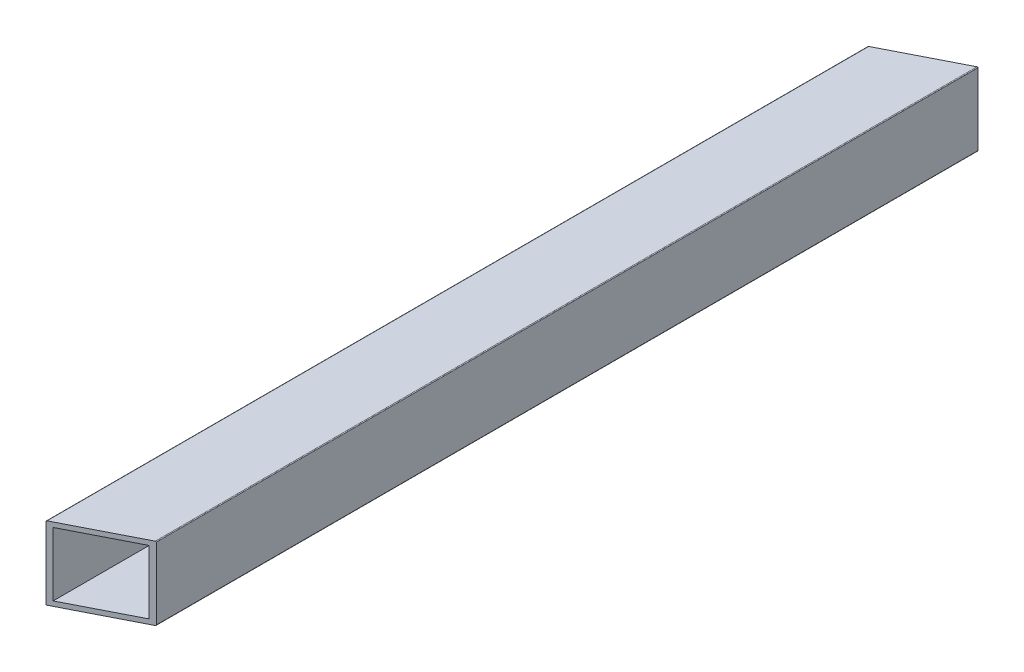
ISO-10303-21;
HEADER;
FILE_DESCRIPTION(('STEP AP214'),'2;1');
FILE_NAME('part.step','',(''),(''),'','','');
FILE_SCHEMA(('AUTOMOTIVE_DESIGN { 1 0 10303 214 1 1 1 1 }'));
ENDSEC;
DATA;
#1=APPLICATION_CONTEXT('core data for automotive mechanical design processes');
#2=APPLICATION_PROTOCOL_DEFINITION('international standard','automotive_design',2000,#1);
#3=PRODUCT_CONTEXT('',#1,'mechanical');
#4=PRODUCT('Part','Part','',(#3));
#5=PRODUCT_RELATED_PRODUCT_CATEGORY('part','',(#4));
#6=PRODUCT_DEFINITION_FORMATION('','',#4);
#7=PRODUCT_DEFINITION_CONTEXT('part definition',#1,'design');
#8=PRODUCT_DEFINITION('design','',#6,#7);
#9=PRODUCT_DEFINITION_SHAPE('','',#8);
#10=(LENGTH_UNIT() NAMED_UNIT(*) SI_UNIT(.MILLI.,.METRE.));
#11=(NAMED_UNIT(*) PLANE_ANGLE_UNIT() SI_UNIT($,.RADIAN.));
#12=(NAMED_UNIT(*) SI_UNIT($,.STERADIAN.) SOLID_ANGLE_UNIT());
#13=UNCERTAINTY_MEASURE_WITH_UNIT(LENGTH_MEASURE(1.E-05),#10,'distance_accuracy_value','');
#14=(GEOMETRIC_REPRESENTATION_CONTEXT(3) GLOBAL_UNCERTAINTY_ASSIGNED_CONTEXT((#13)) GLOBAL_UNIT_ASSIGNED_CONTEXT((#10,
#11,#12)) REPRESENTATION_CONTEXT('',''));
#15=CARTESIAN_POINT('',(0.,0.,0.));
#16=DIRECTION('',(0.,0.,1.));
#17=DIRECTION('',(1.,0.,0.));
#18=AXIS2_PLACEMENT_3D('',#15,#16,#17);
#19=CARTESIAN_POINT('',(-12.7,25.4,149.225));
#20=DIRECTION('',(-0.453990499739547,0.,-0.891006524188368));
#21=DIRECTION('',(-0.891006524188368,0.,0.453990499739547));
#22=AXIS2_PLACEMENT_3D('',#19,#20,#21);
#23=PLANE('',#22);
#24=CARTESIAN_POINT('',(-12.446,-12.446,149.095580535828));
#25=DIRECTION('',(-0.453990499739547,0.,-0.891006524188368));
#26=DIRECTION('',(-0.891006524188368,0.,0.453990499739547));
#27=AXIS2_PLACEMENT_3D('',#24,#25,#26);
#28=ELLIPSE('',#27,0.285070864359128,0.254);
#29=CARTESIAN_POINT('',(-12.7,-12.446,149.225));
#30=VERTEX_POINT('',#29);
#31=CARTESIAN_POINT('',(-12.446,-12.7,149.095580535828));
#32=VERTEX_POINT('',#31);
#33=EDGE_CURVE('E137',#30,#32,#28,.F.);
#34=ORIENTED_EDGE('',*,*,#33,.T.);
#35=DIRECTION('',(0.891006524188367,0.,-0.453990499739547));
#36=VECTOR('',#35,1.);
#37=CARTESIAN_POINT('',(-12.7,-12.7,149.225));
#38=LINE('',#37,#36);
#39=CARTESIAN_POINT('',(12.446,-12.7,136.412473047013));
#40=VERTEX_POINT('',#39);
#41=EDGE_CURVE('E178',#32,#40,#38,.T.);
#42=ORIENTED_EDGE('',*,*,#41,.T.);
#43=CARTESIAN_POINT('',(12.446,-12.446,136.412473047013));
#44=DIRECTION('',(-0.453990499739547,0.,-0.891006524188368));
#45=DIRECTION('',(0.891006524188368,0.,-0.453990499739547));
#46=AXIS2_PLACEMENT_3D('',#43,#44,#45);
#47=ELLIPSE('',#46,0.285070864359128,0.254);
#48=CARTESIAN_POINT('',(12.7,-12.446,136.283053582841));
#49=VERTEX_POINT('',#48);
#50=EDGE_CURVE('E199',#40,#49,#47,.F.);
#51=ORIENTED_EDGE('',*,*,#50,.T.);
#52=DIRECTION('',(0.,-1.,0.));
#53=VECTOR('',#52,1.);
#54=CARTESIAN_POINT('',(12.7,25.4,136.283053582841));
#55=LINE('',#54,#53);
#56=CARTESIAN_POINT('',(12.7,12.446,136.283053582841));
#57=VERTEX_POINT('',#56);
#58=EDGE_CURVE('E192',#57,#49,#55,.T.);
#59=ORIENTED_EDGE('',*,*,#58,.F.);
#60=CARTESIAN_POINT('',(12.446,12.446,136.412473047013));
#61=DIRECTION('',(-0.453990499739547,0.,-0.891006524188368));
#62=DIRECTION('',(-0.891006524188368,0.,0.453990499739547));
#63=AXIS2_PLACEMENT_3D('',#60,#61,#62);
#64=ELLIPSE('',#63,0.285070864359128,0.254);
#65=CARTESIAN_POINT('',(12.446,12.7,136.412473047013));
#66=VERTEX_POINT('',#65);
#67=EDGE_CURVE('E140',#57,#66,#64,.F.);
#68=ORIENTED_EDGE('',*,*,#67,.T.);
#69=DIRECTION('',(-0.891006524188368,0.,0.453990499739547));
#70=VECTOR('',#69,1.);
#71=CARTESIAN_POINT('',(-12.7,12.7,149.225));
#72=LINE('',#71,#70);
#73=CARTESIAN_POINT('',(-12.446,12.7,149.095580535828));
#74=VERTEX_POINT('',#73);
#75=EDGE_CURVE('E194',#66,#74,#72,.T.);
#76=ORIENTED_EDGE('',*,*,#75,.T.);
#77=CARTESIAN_POINT('',(-12.446,12.446,149.095580535828));
#78=DIRECTION('',(-0.453990499739547,0.,-0.891006524188368));
#79=DIRECTION('',(0.891006524188368,0.,-0.453990499739547));
#80=AXIS2_PLACEMENT_3D('',#77,#78,#79);
#81=ELLIPSE('',#80,0.285070864359128,0.254);
#82=CARTESIAN_POINT('',(-12.7,12.446,149.225));
#83=VERTEX_POINT('',#82);
#84=EDGE_CURVE('E197',#74,#83,#81,.F.);
#85=ORIENTED_EDGE('',*,*,#84,.T.);
#86=DIRECTION('',(0.,1.,0.));
#87=VECTOR('',#86,1.);
#88=CARTESIAN_POINT('',(-12.7,-12.7,149.225));
#89=LINE('',#88,#87);
#90=EDGE_CURVE('E136',#30,#83,#89,.T.);
#91=ORIENTED_EDGE('',*,*,#90,.F.);
#92=EDGE_LOOP('',(#34,#42,#51,#59,#68,#76,#85,#91));
#93=FACE_BOUND('',#92,.T.);
#94=DIRECTION('',(-0.891006524188368,0.,0.453990499739547));
#95=VECTOR('',#94,1.);
#96=CARTESIAN_POINT('',(-12.7,11.049,149.225));
#97=LINE('',#96,#95);
#98=CARTESIAN_POINT('',(11.049,11.049,137.124280099957));
#99=VERTEX_POINT('',#98);
#100=CARTESIAN_POINT('',(-11.049,11.049,148.383773482885));
#101=VERTEX_POINT('',#100);
#102=EDGE_CURVE('E40',#99,#101,#97,.T.);
#103=ORIENTED_EDGE('',*,*,#102,.F.);
#104=DIRECTION('',(0.,1.,0.));
#105=VECTOR('',#104,1.);
#106=CARTESIAN_POINT('',(11.049,25.4,137.124280099957));
#107=LINE('',#106,#105);
#108=CARTESIAN_POINT('',(11.049,-11.049,137.124280099957));
#109=VERTEX_POINT('',#108);
#110=EDGE_CURVE('E153',#109,#99,#107,.T.);
#111=ORIENTED_EDGE('',*,*,#110,.F.);
#112=DIRECTION('',(-0.891006524188368,0.,0.453990499739547));
#113=VECTOR('',#112,1.);
#114=CARTESIAN_POINT('',(-12.7,-11.049,149.225));
#115=LINE('',#114,#113);
#116=CARTESIAN_POINT('',(-11.049,-11.049,148.383773482885));
#117=VERTEX_POINT('',#116);
#118=EDGE_CURVE('E155',#109,#117,#115,.T.);
#119=ORIENTED_EDGE('',*,*,#118,.T.);
#120=DIRECTION('',(0.,1.,0.));
#121=VECTOR('',#120,1.);
#122=CARTESIAN_POINT('',(-11.049,25.4,148.383773482885));
#123=LINE('',#122,#121);
#124=EDGE_CURVE('E158',#117,#101,#123,.T.);
#125=ORIENTED_EDGE('',*,*,#124,.T.);
#126=EDGE_LOOP('',(#103,#111,#119,#125));
#127=FACE_BOUND('',#126,.T.);
#128=ADVANCED_FACE('F32',(#93,#127),#23,.F.);
#129=CARTESIAN_POINT('',(-12.7,12.7,149.225));
#130=DIRECTION('',(0.,1.,0.));
#131=DIRECTION('',(0.,0.,1.));
#132=AXIS2_PLACEMENT_3D('',#129,#130,#131);
#133=PLANE('',#132);
#134=DIRECTION('',(0.891006524188371,0.,-0.453990499739541));
#135=VECTOR('',#134,1.);
#136=CARTESIAN_POINT('',(-128.190433689715,12.7,-77.4377384447841));
#137=LINE('',#136,#135);
#138=CARTESIAN_POINT('',(-12.446,12.7,-136.412473047013));
#139=VERTEX_POINT('',#138);
#140=CARTESIAN_POINT('',(12.446,12.7,-149.095580535828));
#141=VERTEX_POINT('',#140);
#142=EDGE_CURVE('E47',#139,#141,#137,.T.);
#143=ORIENTED_EDGE('',*,*,#142,.F.);
#144=DIRECTION('',(0.,0.,-1.));
#145=VECTOR('',#144,1.);
#146=CARTESIAN_POINT('',(-12.446,12.7,149.225));
#147=LINE('',#146,#145);
#148=EDGE_CURVE('E150',#139,#74,#147,.F.);
#149=ORIENTED_EDGE('',*,*,#148,.T.);
#150=ORIENTED_EDGE('',*,*,#75,.F.);
#151=DIRECTION('',(0.,0.,-1.));
#152=VECTOR('',#151,1.);
#153=CARTESIAN_POINT('',(12.446,12.7,-149.225));
#154=LINE('',#153,#152);
#155=EDGE_CURVE('E143',#66,#141,#154,.T.);
#156=ORIENTED_EDGE('',*,*,#155,.T.);
#157=EDGE_LOOP('',(#143,#149,#150,#156));
#158=FACE_BOUND('',#157,.T.);
#159=ADVANCED_FACE('F258',(#158),#133,.T.);
#160=CARTESIAN_POINT('',(-12.7,-12.7,149.225));
#161=DIRECTION('',(-1.,0.,0.));
#162=DIRECTION('',(0.,0.,1.));
#163=AXIS2_PLACEMENT_3D('',#160,#161,#162);
#164=PLANE('',#163);
#165=DIRECTION('',(0.,-1.,0.));
#166=VECTOR('',#165,1.);
#167=CARTESIAN_POINT('',(-12.7,673.1,-136.283053582842));
#168=LINE('',#167,#166);
#169=CARTESIAN_POINT('',(-12.7,12.446,-136.283053582842));
#170=VERTEX_POINT('',#169);
#171=CARTESIAN_POINT('',(-12.7,-12.446,-136.283053582842));
#172=VERTEX_POINT('',#171);
#173=EDGE_CURVE('E213',#170,#172,#168,.T.);
#174=ORIENTED_EDGE('',*,*,#173,.T.);
#175=DIRECTION('',(0.,0.,-1.));
#176=VECTOR('',#175,1.);
#177=CARTESIAN_POINT('',(-12.7,-12.446,149.225));
#178=LINE('',#177,#176);
#179=EDGE_CURVE('E141',#172,#30,#178,.F.);
#180=ORIENTED_EDGE('',*,*,#179,.T.);
#181=ORIENTED_EDGE('',*,*,#90,.T.);
#182=DIRECTION('',(0.,0.,-1.));
#183=VECTOR('',#182,1.);
#184=CARTESIAN_POINT('',(-12.7,12.446,149.225));
#185=LINE('',#184,#183);
#186=EDGE_CURVE('E145',#83,#170,#185,.T.);
#187=ORIENTED_EDGE('',*,*,#186,.T.);
#188=EDGE_LOOP('',(#174,#180,#181,#187));
#189=FACE_BOUND('',#188,.T.);
#190=ADVANCED_FACE('F212',(#189),#164,.T.);
#191=CARTESIAN_POINT('',(-12.7,-12.7,149.225));
#192=DIRECTION('',(0.,1.,0.));
#193=DIRECTION('',(0.,0.,1.));
#194=AXIS2_PLACEMENT_3D('',#191,#192,#193);
#195=PLANE('',#194);
#196=DIRECTION('',(0.,0.,-1.));
#197=VECTOR('',#196,1.);
#198=CARTESIAN_POINT('',(-12.446,-12.7,-149.225));
#199=LINE('',#198,#197);
#200=CARTESIAN_POINT('',(-12.446,-12.7,-136.412473047013));
#201=VERTEX_POINT('',#200);
#202=EDGE_CURVE('E206',#32,#201,#199,.T.);
#203=ORIENTED_EDGE('',*,*,#202,.T.);
#204=DIRECTION('',(-0.891006524188371,0.,0.453990499739541));
#205=VECTOR('',#204,1.);
#206=CARTESIAN_POINT('',(12.7,-12.7,-149.225));
#207=LINE('',#206,#205);
#208=CARTESIAN_POINT('',(12.446,-12.7,-149.095580535828));
#209=VERTEX_POINT('',#208);
#210=EDGE_CURVE('E235',#209,#201,#207,.T.);
#211=ORIENTED_EDGE('',*,*,#210,.F.);
#212=DIRECTION('',(0.,0.,-1.));
#213=VECTOR('',#212,1.);
#214=CARTESIAN_POINT('',(12.446,-12.7,149.225));
#215=LINE('',#214,#213);
#216=EDGE_CURVE('E203',#209,#40,#215,.F.);
#217=ORIENTED_EDGE('',*,*,#216,.T.);
#218=ORIENTED_EDGE('',*,*,#41,.F.);
#219=EDGE_LOOP('',(#203,#211,#217,#218));
#220=FACE_BOUND('',#219,.T.);
#221=ADVANCED_FACE('F245',(#220),#195,.F.);
#222=CARTESIAN_POINT('',(12.7,-12.7,149.225));
#223=DIRECTION('',(-1.,0.,0.));
#224=DIRECTION('',(0.,0.,1.));
#225=AXIS2_PLACEMENT_3D('',#222,#223,#224);
#226=PLANE('',#225);
#227=DIRECTION('',(0.,0.,-1.));
#228=VECTOR('',#227,1.);
#229=CARTESIAN_POINT('',(12.7,12.446,149.225));
#230=LINE('',#229,#228);
#231=CARTESIAN_POINT('',(12.7,12.446,-149.225));
#232=VERTEX_POINT('',#231);
#233=EDGE_CURVE('E133',#232,#57,#230,.F.);
#234=ORIENTED_EDGE('',*,*,#233,.T.);
#235=ORIENTED_EDGE('',*,*,#58,.T.);
#236=DIRECTION('',(0.,0.,-1.));
#237=VECTOR('',#236,1.);
#238=CARTESIAN_POINT('',(12.7,-12.446,149.225));
#239=LINE('',#238,#237);
#240=CARTESIAN_POINT('',(12.7,-12.446,-149.225));
#241=VERTEX_POINT('',#240);
#242=EDGE_CURVE('E135',#49,#241,#239,.T.);
#243=ORIENTED_EDGE('',*,*,#242,.T.);
#244=DIRECTION('',(0.,1.,0.));
#245=VECTOR('',#244,1.);
#246=CARTESIAN_POINT('',(12.7,-12.7,-149.225));
#247=LINE('',#246,#245);
#248=EDGE_CURVE('E120',#241,#232,#247,.T.);
#249=ORIENTED_EDGE('',*,*,#248,.T.);
#250=EDGE_LOOP('',(#234,#235,#243,#249));
#251=FACE_BOUND('',#250,.T.);
#252=ADVANCED_FACE('F131',(#251),#226,.F.);
#253=CARTESIAN_POINT('',(-12.446,-12.446,149.225));
#254=DIRECTION('',(0.,0.,1.));
#255=DIRECTION('',(1.,0.,0.));
#256=AXIS2_PLACEMENT_3D('',#253,#254,#255);
#257=CYLINDRICAL_SURFACE('',#256,0.254);
#258=CARTESIAN_POINT('',(-12.446,-12.446,-136.412473047013));
#259=DIRECTION('',(0.453990499739541,0.,0.891006524188371));
#260=DIRECTION('',(-0.891006524188371,0.,0.453990499739541));
#261=AXIS2_PLACEMENT_3D('',#258,#259,#260);
#262=ELLIPSE('',#261,0.285070864359127,0.254);
#263=EDGE_CURVE('E224',#201,#172,#262,.F.);
#264=ORIENTED_EDGE('',*,*,#263,.F.);
#265=ORIENTED_EDGE('',*,*,#202,.F.);
#266=ORIENTED_EDGE('',*,*,#33,.F.);
#267=ORIENTED_EDGE('',*,*,#179,.F.);
#268=EDGE_LOOP('',(#264,#265,#266,#267));
#269=FACE_BOUND('',#268,.T.);
#270=ADVANCED_FACE('F242',(#269),#257,.T.);
#271=CARTESIAN_POINT('',(12.446,-12.446,149.225));
#272=DIRECTION('',(0.,0.,-1.));
#273=DIRECTION('',(-1.,0.,0.));
#274=AXIS2_PLACEMENT_3D('',#271,#272,#273);
#275=CYLINDRICAL_SURFACE('',#274,0.254);
#276=CARTESIAN_POINT('',(12.446,-12.446,-149.095580535828));
#277=DIRECTION('',(0.453990499739541,0.,0.891006524188371));
#278=DIRECTION('',(0.891006524188371,0.,-0.453990499739541));
#279=AXIS2_PLACEMENT_3D('',#276,#277,#278);
#280=ELLIPSE('',#279,0.285070864359127,0.254);
#281=EDGE_CURVE('E222',#241,#209,#280,.F.);
#282=ORIENTED_EDGE('',*,*,#281,.F.);
#283=ORIENTED_EDGE('',*,*,#242,.F.);
#284=ORIENTED_EDGE('',*,*,#50,.F.);
#285=ORIENTED_EDGE('',*,*,#216,.F.);
#286=EDGE_LOOP('',(#282,#283,#284,#285));
#287=FACE_BOUND('',#286,.T.);
#288=ADVANCED_FACE('F249',(#287),#275,.T.);
#289=CARTESIAN_POINT('',(-12.446,12.446,149.225));
#290=DIRECTION('',(0.,0.,-1.));
#291=DIRECTION('',(-1.,0.,0.));
#292=AXIS2_PLACEMENT_3D('',#289,#290,#291);
#293=CYLINDRICAL_SURFACE('',#292,0.254);
#294=CARTESIAN_POINT('',(-12.446,12.446,-136.412473047013));
#295=DIRECTION('',(0.453990499739541,0.,0.891006524188371));
#296=DIRECTION('',(0.891006524188371,0.,-0.453990499739541));
#297=AXIS2_PLACEMENT_3D('',#294,#295,#296);
#298=ELLIPSE('',#297,0.285070864359127,0.254);
#299=EDGE_CURVE('E221',#170,#139,#298,.F.);
#300=ORIENTED_EDGE('',*,*,#299,.F.);
#301=ORIENTED_EDGE('',*,*,#186,.F.);
#302=ORIENTED_EDGE('',*,*,#84,.F.);
#303=ORIENTED_EDGE('',*,*,#148,.F.);
#304=EDGE_LOOP('',(#300,#301,#302,#303));
#305=FACE_BOUND('',#304,.T.);
#306=ADVANCED_FACE('F219',(#305),#293,.T.);
#307=CARTESIAN_POINT('',(12.446,12.446,149.225));
#308=DIRECTION('',(0.,0.,1.));
#309=DIRECTION('',(1.,0.,0.));
#310=AXIS2_PLACEMENT_3D('',#307,#308,#309);
#311=CYLINDRICAL_SURFACE('',#310,0.254);
#312=CARTESIAN_POINT('',(12.446,12.446,-149.095580535828));
#313=DIRECTION('',(0.453990499739541,0.,0.891006524188371));
#314=DIRECTION('',(-0.891006524188371,0.,0.453990499739541));
#315=AXIS2_PLACEMENT_3D('',#312,#313,#314);
#316=ELLIPSE('',#315,0.285070864359127,0.254);
#317=EDGE_CURVE('E117',#141,#232,#316,.F.);
#318=ORIENTED_EDGE('',*,*,#317,.F.);
#319=ORIENTED_EDGE('',*,*,#155,.F.);
#320=ORIENTED_EDGE('',*,*,#67,.F.);
#321=ORIENTED_EDGE('',*,*,#233,.F.);
#322=EDGE_LOOP('',(#318,#319,#320,#321));
#323=FACE_BOUND('',#322,.T.);
#324=ADVANCED_FACE('F34',(#323),#311,.T.);
#325=CARTESIAN_POINT('',(11.049,11.049,536.575));
#326=DIRECTION('',(0.,-1.,0.));
#327=DIRECTION('',(0.,0.,-1.));
#328=AXIS2_PLACEMENT_3D('',#325,#326,#327);
#329=PLANE('',#328);
#330=DIRECTION('',(-0.891006524188371,0.,0.453990499739541));
#331=VECTOR('',#330,1.);
#332=CARTESIAN_POINT('',(-266.022644096934,11.049,-7.20871948223611));
#333=LINE('',#332,#331);
#334=CARTESIAN_POINT('',(11.049,11.049,-148.383773482885));
#335=VERTEX_POINT('',#334);
#336=CARTESIAN_POINT('',(-11.049,11.049,-137.124280099957));
#337=VERTEX_POINT('',#336);
#338=EDGE_CURVE('E126',#335,#337,#333,.T.);
#339=ORIENTED_EDGE('',*,*,#338,.F.);
#340=DIRECTION('',(0.,0.,-1.));
#341=VECTOR('',#340,1.);
#342=CARTESIAN_POINT('',(11.049,11.049,536.575));
#343=LINE('',#342,#341);
#344=EDGE_CURVE('E169',#99,#335,#343,.T.);
#345=ORIENTED_EDGE('',*,*,#344,.F.);
#346=ORIENTED_EDGE('',*,*,#102,.T.);
#347=DIRECTION('',(0.,0.,-1.));
#348=VECTOR('',#347,1.);
#349=CARTESIAN_POINT('',(-11.049,11.049,536.575));
#350=LINE('',#349,#348);
#351=EDGE_CURVE('E167',#101,#337,#350,.T.);
#352=ORIENTED_EDGE('',*,*,#351,.T.);
#353=EDGE_LOOP('',(#339,#345,#346,#352));
#354=FACE_BOUND('',#353,.T.);
#355=ADVANCED_FACE('F166',(#354),#329,.T.);
#356=CARTESIAN_POINT('',(-11.049,-11.049,536.575));
#357=DIRECTION('',(-1.,0.,0.));
#358=DIRECTION('',(0.,0.,1.));
#359=AXIS2_PLACEMENT_3D('',#356,#357,#358);
#360=PLANE('',#359);
#361=DIRECTION('',(0.,0.,-1.));
#362=VECTOR('',#361,1.);
#363=CARTESIAN_POINT('',(-11.049,-11.049,536.575));
#364=LINE('',#363,#362);
#365=CARTESIAN_POINT('',(-11.049,-11.049,-137.124280099957));
#366=VERTEX_POINT('',#365);
#367=EDGE_CURVE('E179',#117,#366,#364,.T.);
#368=ORIENTED_EDGE('',*,*,#367,.T.);
#369=DIRECTION('',(0.,1.,0.));
#370=VECTOR('',#369,1.);
#371=CARTESIAN_POINT('',(-11.049,-11.049,-137.124280099957));
#372=LINE('',#371,#370);
#373=EDGE_CURVE('E177',#366,#337,#372,.T.);
#374=ORIENTED_EDGE('',*,*,#373,.T.);
#375=ORIENTED_EDGE('',*,*,#351,.F.);
#376=ORIENTED_EDGE('',*,*,#124,.F.);
#377=EDGE_LOOP('',(#368,#374,#375,#376));
#378=FACE_BOUND('',#377,.T.);
#379=ADVANCED_FACE('F175',(#378),#360,.F.);
#380=CARTESIAN_POINT('',(11.049,-11.049,536.575));
#381=DIRECTION('',(0.,-1.,0.));
#382=DIRECTION('',(0.,0.,-1.));
#383=AXIS2_PLACEMENT_3D('',#380,#381,#382);
#384=PLANE('',#383);
#385=DIRECTION('',(0.,0.,-1.));
#386=VECTOR('',#385,1.);
#387=CARTESIAN_POINT('',(11.049,-11.049,536.575));
#388=LINE('',#387,#386);
#389=CARTESIAN_POINT('',(11.049,-11.049,-148.383773482885));
#390=VERTEX_POINT('',#389);
#391=EDGE_CURVE('E185',#109,#390,#388,.T.);
#392=ORIENTED_EDGE('',*,*,#391,.T.);
#393=DIRECTION('',(-0.891006524188371,0.,0.453990499739541));
#394=VECTOR('',#393,1.);
#395=CARTESIAN_POINT('',(-266.022644096934,-11.049,-7.20871948223611));
#396=LINE('',#395,#394);
#397=EDGE_CURVE('E54',#390,#366,#396,.T.);
#398=ORIENTED_EDGE('',*,*,#397,.T.);
#399=ORIENTED_EDGE('',*,*,#367,.F.);
#400=ORIENTED_EDGE('',*,*,#118,.F.);
#401=EDGE_LOOP('',(#392,#398,#399,#400));
#402=FACE_BOUND('',#401,.T.);
#403=ADVANCED_FACE('F184',(#402),#384,.F.);
#404=CARTESIAN_POINT('',(11.049,-11.049,536.575));
#405=DIRECTION('',(-1.,0.,0.));
#406=DIRECTION('',(0.,0.,1.));
#407=AXIS2_PLACEMENT_3D('',#404,#405,#406);
#408=PLANE('',#407);
#409=DIRECTION('',(0.,1.,0.));
#410=VECTOR('',#409,1.);
#411=CARTESIAN_POINT('',(11.049,-11.049,-148.383773482885));
#412=LINE('',#411,#410);
#413=EDGE_CURVE('E11',#390,#335,#412,.T.);
#414=ORIENTED_EDGE('',*,*,#413,.F.);
#415=ORIENTED_EDGE('',*,*,#391,.F.);
#416=ORIENTED_EDGE('',*,*,#110,.T.);
#417=ORIENTED_EDGE('',*,*,#344,.T.);
#418=EDGE_LOOP('',(#414,#415,#416,#417));
#419=FACE_BOUND('',#418,.T.);
#420=ADVANCED_FACE('F229',(#419),#408,.T.);
#421=CARTESIAN_POINT('',(12.7,673.1,-149.225));
#422=DIRECTION('',(0.453990499739541,0.,0.891006524188371));
#423=DIRECTION('',(0.891006524188371,0.,-0.453990499739541));
#424=AXIS2_PLACEMENT_3D('',#421,#422,#423);
#425=PLANE('',#424);
#426=ORIENTED_EDGE('',*,*,#263,.T.);
#427=ORIENTED_EDGE('',*,*,#173,.F.);
#428=ORIENTED_EDGE('',*,*,#299,.T.);
#429=ORIENTED_EDGE('',*,*,#142,.T.);
#430=ORIENTED_EDGE('',*,*,#317,.T.);
#431=ORIENTED_EDGE('',*,*,#248,.F.);
#432=ORIENTED_EDGE('',*,*,#281,.T.);
#433=ORIENTED_EDGE('',*,*,#210,.T.);
#434=EDGE_LOOP('',(#426,#427,#428,#429,#430,#431,#432,#433));
#435=FACE_BOUND('',#434,.T.);
#436=ORIENTED_EDGE('',*,*,#338,.T.);
#437=ORIENTED_EDGE('',*,*,#373,.F.);
#438=ORIENTED_EDGE('',*,*,#397,.F.);
#439=ORIENTED_EDGE('',*,*,#413,.T.);
#440=EDGE_LOOP('',(#436,#437,#438,#439));
#441=FACE_BOUND('',#440,.T.);
#442=ADVANCED_FACE('F119',(#435,#441),#425,.F.);
#443=CLOSED_SHELL('',(#128,#159,#190,#221,#252,#270,#288,#306,#324,#355,#379,#403,#420,#442));
#444=MANIFOLD_SOLID_BREP('B2',#443);
#445=ADVANCED_BREP_SHAPE_REPRESENTATION('',(#18,#444),#14);
#446=SHAPE_DEFINITION_REPRESENTATION(#9,#445);
ENDSEC;
END-ISO-10303-21;
